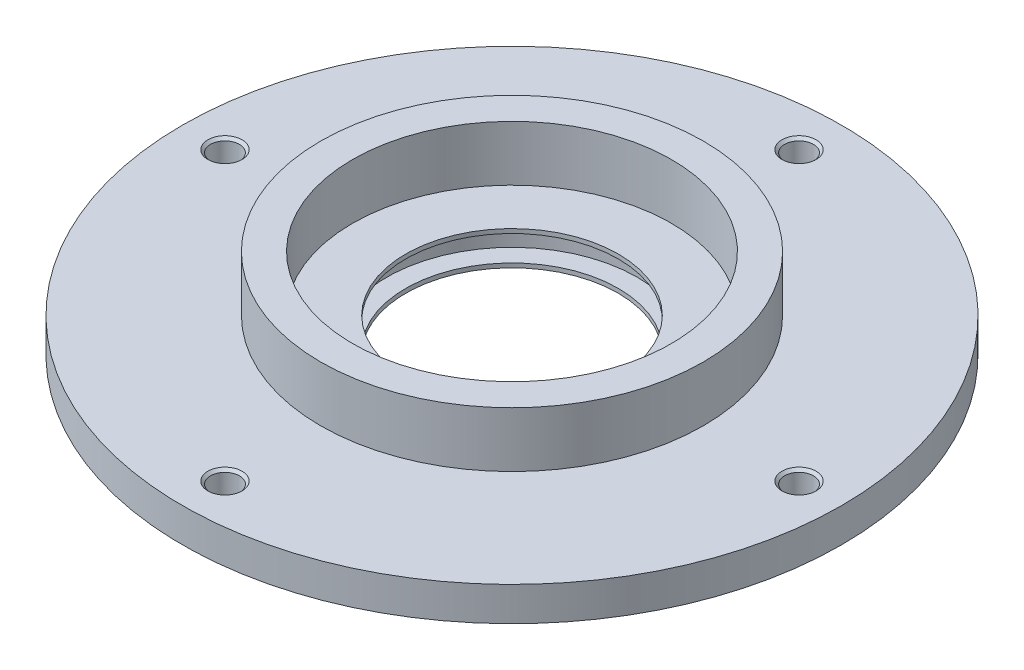
ISO-10303-21;
HEADER;
FILE_DESCRIPTION(('STEP AP214'),'2;1');
FILE_NAME('part.step','',(''),(''),'','','');
FILE_SCHEMA(('AUTOMOTIVE_DESIGN { 1 0 10303 214 1 1 1 1 }'));
ENDSEC;
DATA;
#1=APPLICATION_CONTEXT('core data for automotive mechanical design processes');
#2=APPLICATION_PROTOCOL_DEFINITION('international standard','automotive_design',2000,#1);
#3=PRODUCT_CONTEXT('',#1,'mechanical');
#4=PRODUCT('Part','Part','',(#3));
#5=PRODUCT_RELATED_PRODUCT_CATEGORY('part','',(#4));
#6=PRODUCT_DEFINITION_FORMATION('','',#4);
#7=PRODUCT_DEFINITION_CONTEXT('part definition',#1,'design');
#8=PRODUCT_DEFINITION('design','',#6,#7);
#9=PRODUCT_DEFINITION_SHAPE('','',#8);
#10=(LENGTH_UNIT() NAMED_UNIT(*) SI_UNIT(.MILLI.,.METRE.));
#11=(NAMED_UNIT(*) PLANE_ANGLE_UNIT() SI_UNIT($,.RADIAN.));
#12=(NAMED_UNIT(*) SI_UNIT($,.STERADIAN.) SOLID_ANGLE_UNIT());
#13=UNCERTAINTY_MEASURE_WITH_UNIT(LENGTH_MEASURE(1.E-05),#10,'distance_accuracy_value','');
#14=(GEOMETRIC_REPRESENTATION_CONTEXT(3) GLOBAL_UNCERTAINTY_ASSIGNED_CONTEXT((#13)) GLOBAL_UNIT_ASSIGNED_CONTEXT((#10,
#11,#12)) REPRESENTATION_CONTEXT('',''));
#15=CARTESIAN_POINT('',(0.,0.,0.));
#16=DIRECTION('',(0.,0.,1.));
#17=DIRECTION('',(1.,0.,0.));
#18=AXIS2_PLACEMENT_3D('',#15,#16,#17);
#19=CARTESIAN_POINT('',(0.,21.,0.));
#20=DIRECTION('',(0.,-1.,0.));
#21=DIRECTION('',(0.,0.,-1.));
#22=AXIS2_PLACEMENT_3D('',#19,#20,#21);
#23=CYLINDRICAL_SURFACE('',#22,25.);
#24=CARTESIAN_POINT('',(0.,7.99999999999999,0.));
#25=DIRECTION('',(0.,-1.,0.));
#26=DIRECTION('',(1.,0.,0.));
#27=AXIS2_PLACEMENT_3D('',#24,#25,#26);
#28=CIRCLE('',#27,25.);
#29=CARTESIAN_POINT('',(25.,8.,0.));
#30=VERTEX_POINT('',#29);
#31=EDGE_CURVE('E58',#30,#30,#28,.F.);
#32=ORIENTED_EDGE('',*,*,#31,.T.);
#33=EDGE_LOOP('',(#32));
#34=FACE_BOUND('',#33,.T.);
#35=CARTESIAN_POINT('',(0.,7.,0.));
#36=DIRECTION('',(0.,-1.,0.));
#37=DIRECTION('',(0.,0.,-1.));
#38=AXIS2_PLACEMENT_3D('',#35,#36,#37);
#39=CIRCLE('',#38,25.);
#40=CARTESIAN_POINT('',(0.,7.,-25.));
#41=VERTEX_POINT('',#40);
#42=EDGE_CURVE('E61',#41,#41,#39,.T.);
#43=ORIENTED_EDGE('',*,*,#42,.T.);
#44=EDGE_LOOP('',(#43));
#45=FACE_BOUND('',#44,.T.);
#46=ADVANCED_FACE('F43',(#34,#45),#23,.F.);
#47=CARTESIAN_POINT('',(0.,0.,0.));
#48=DIRECTION('',(0.,1.,0.));
#49=DIRECTION('',(-1.,0.,0.));
#50=AXIS2_PLACEMENT_3D('',#47,#48,#49);
#51=PLANE('',#50);
#52=CARTESIAN_POINT('',(0.,0.,0.));
#53=DIRECTION('',(0.,1.,0.));
#54=DIRECTION('',(0.,0.,1.));
#55=AXIS2_PLACEMENT_3D('',#52,#53,#54);
#56=CIRCLE('',#55,25.);
#57=CARTESIAN_POINT('',(0.,0.,25.));
#58=VERTEX_POINT('',#57);
#59=EDGE_CURVE('E64',#58,#58,#56,.T.);
#60=ORIENTED_EDGE('',*,*,#59,.T.);
#61=EDGE_LOOP('',(#60));
#62=FACE_BOUND('',#61,.T.);
#63=CARTESIAN_POINT('',(-67.5,-1.28369537222284E-13,0.));
#64=DIRECTION('',(0.,1.,0.));
#65=DIRECTION('',(0.,0.,1.));
#66=AXIS2_PLACEMENT_3D('',#63,#64,#65);
#67=CIRCLE('',#66,3.4);
#68=CARTESIAN_POINT('',(-67.5,-1.28369537222284E-13,3.4));
#69=VERTEX_POINT('',#68);
#70=EDGE_CURVE('E83',#69,#69,#67,.T.);
#71=ORIENTED_EDGE('',*,*,#70,.T.);
#72=EDGE_LOOP('',(#71));
#73=FACE_BOUND('',#72,.T.);
#74=CARTESIAN_POINT('',(67.5,0.,0.));
#75=DIRECTION('',(0.,1.,0.));
#76=DIRECTION('',(0.,0.,1.));
#77=AXIS2_PLACEMENT_3D('',#74,#75,#76);
#78=CIRCLE('',#77,3.4);
#79=CARTESIAN_POINT('',(67.5,0.,3.4));
#80=VERTEX_POINT('',#79);
#81=EDGE_CURVE('E94',#80,#80,#78,.T.);
#82=ORIENTED_EDGE('',*,*,#81,.T.);
#83=EDGE_LOOP('',(#82));
#84=FACE_BOUND('',#83,.T.);
#85=CARTESIAN_POINT('',(0.,0.,67.5));
#86=DIRECTION('',(0.,1.,0.));
#87=DIRECTION('',(0.,0.,1.));
#88=AXIS2_PLACEMENT_3D('',#85,#86,#87);
#89=CIRCLE('',#88,3.4);
#90=CARTESIAN_POINT('',(0.,0.,70.9));
#91=VERTEX_POINT('',#90);
#92=EDGE_CURVE('E101',#91,#91,#89,.T.);
#93=ORIENTED_EDGE('',*,*,#92,.T.);
#94=EDGE_LOOP('',(#93));
#95=FACE_BOUND('',#94,.T.);
#96=CARTESIAN_POINT('',(0.,0.,-67.5));
#97=DIRECTION('',(0.,1.,0.));
#98=DIRECTION('',(0.,0.,1.));
#99=AXIS2_PLACEMENT_3D('',#96,#97,#98);
#100=CIRCLE('',#99,3.4);
#101=CARTESIAN_POINT('',(0.,0.,-64.1));
#102=VERTEX_POINT('',#101);
#103=EDGE_CURVE('E115',#102,#102,#100,.T.);
#104=ORIENTED_EDGE('',*,*,#103,.T.);
#105=EDGE_LOOP('',(#104));
#106=FACE_BOUND('',#105,.T.);
#107=CARTESIAN_POINT('',(0.,0.,0.));
#108=DIRECTION('',(0.,1.,0.));
#109=DIRECTION('',(-1.,0.,0.));
#110=AXIS2_PLACEMENT_3D('',#107,#108,#109);
#111=CIRCLE('',#110,77.5);
#112=CARTESIAN_POINT('',(-77.5,0.,0.));
#113=VERTEX_POINT('',#112);
#114=EDGE_CURVE('E10',#113,#113,#111,.T.);
#115=ORIENTED_EDGE('',*,*,#114,.F.);
#116=EDGE_LOOP('',(#115));
#117=FACE_BOUND('',#116,.T.);
#118=ADVANCED_FACE('F44',(#62,#73,#84,#95,#106,#117),#51,.F.);
#119=CARTESIAN_POINT('',(0.,8.,0.));
#120=DIRECTION('',(0.,1.,0.));
#121=DIRECTION('',(-1.,0.,0.));
#122=AXIS2_PLACEMENT_3D('',#119,#120,#121);
#123=CYLINDRICAL_SURFACE('',#122,77.5);
#124=CARTESIAN_POINT('',(0.,7.99999999999997,0.));
#125=DIRECTION('',(0.,1.,0.));
#126=DIRECTION('',(-1.,0.,0.));
#127=AXIS2_PLACEMENT_3D('',#124,#125,#126);
#128=CIRCLE('',#127,77.5);
#129=CARTESIAN_POINT('',(-77.5,7.99999999999993,0.));
#130=VERTEX_POINT('',#129);
#131=EDGE_CURVE('E51',#130,#130,#128,.T.);
#132=ORIENTED_EDGE('',*,*,#131,.F.);
#133=EDGE_LOOP('',(#132));
#134=FACE_BOUND('',#133,.T.);
#135=ORIENTED_EDGE('',*,*,#114,.T.);
#136=EDGE_LOOP('',(#135));
#137=FACE_BOUND('',#136,.T.);
#138=ADVANCED_FACE('F131',(#134,#137),#123,.T.);
#139=CARTESIAN_POINT('',(77.5,8.00000000000001,0.));
#140=DIRECTION('',(0.,-1.,0.));
#141=DIRECTION('',(1.,0.,0.));
#142=AXIS2_PLACEMENT_3D('',#139,#140,#141);
#143=PLANE('',#142);
#144=CARTESIAN_POINT('',(-67.5,7.99999999999994,0.));
#145=DIRECTION('',(0.,1.,0.));
#146=DIRECTION('',(0.,0.,1.));
#147=AXIS2_PLACEMENT_3D('',#144,#145,#146);
#148=CIRCLE('',#147,4.025);
#149=CARTESIAN_POINT('',(-67.5,7.99999999999994,4.025));
#150=VERTEX_POINT('',#149);
#151=EDGE_CURVE('E65',#150,#150,#148,.T.);
#152=ORIENTED_EDGE('',*,*,#151,.F.);
#153=EDGE_LOOP('',(#152));
#154=FACE_BOUND('',#153,.T.);
#155=CARTESIAN_POINT('',(67.5,8.,0.));
#156=DIRECTION('',(0.,1.,0.));
#157=DIRECTION('',(0.,0.,1.));
#158=AXIS2_PLACEMENT_3D('',#155,#156,#157);
#159=CIRCLE('',#158,4.025);
#160=CARTESIAN_POINT('',(67.5,8.,4.025));
#161=VERTEX_POINT('',#160);
#162=EDGE_CURVE('E87',#161,#161,#159,.T.);
#163=ORIENTED_EDGE('',*,*,#162,.F.);
#164=EDGE_LOOP('',(#163));
#165=FACE_BOUND('',#164,.T.);
#166=CARTESIAN_POINT('',(0.,7.99999999999997,67.5));
#167=DIRECTION('',(0.,1.,0.));
#168=DIRECTION('',(0.,0.,1.));
#169=AXIS2_PLACEMENT_3D('',#166,#167,#168);
#170=CIRCLE('',#169,4.025);
#171=CARTESIAN_POINT('',(0.,7.99999999999997,71.525));
#172=VERTEX_POINT('',#171);
#173=EDGE_CURVE('E97',#172,#172,#170,.T.);
#174=ORIENTED_EDGE('',*,*,#173,.F.);
#175=EDGE_LOOP('',(#174));
#176=FACE_BOUND('',#175,.T.);
#177=CARTESIAN_POINT('',(0.,7.99999999999997,-67.5));
#178=DIRECTION('',(0.,1.,0.));
#179=DIRECTION('',(0.,0.,1.));
#180=AXIS2_PLACEMENT_3D('',#177,#178,#179);
#181=CIRCLE('',#180,4.025);
#182=CARTESIAN_POINT('',(0.,7.99999999999997,-63.475));
#183=VERTEX_POINT('',#182);
#184=EDGE_CURVE('E106',#183,#183,#181,.T.);
#185=ORIENTED_EDGE('',*,*,#184,.F.);
#186=EDGE_LOOP('',(#185));
#187=FACE_BOUND('',#186,.T.);
#188=CARTESIAN_POINT('',(0.,7.99999999999998,0.));
#189=DIRECTION('',(0.,1.,0.));
#190=DIRECTION('',(-1.,0.,0.));
#191=AXIS2_PLACEMENT_3D('',#188,#189,#190);
#192=CIRCLE('',#191,45.);
#193=CARTESIAN_POINT('',(-45.,7.99999999999996,0.));
#194=VERTEX_POINT('',#193);
#195=EDGE_CURVE('E57',#194,#194,#192,.T.);
#196=ORIENTED_EDGE('',*,*,#195,.F.);
#197=EDGE_LOOP('',(#196));
#198=FACE_BOUND('',#197,.T.);
#199=ORIENTED_EDGE('',*,*,#131,.T.);
#200=EDGE_LOOP('',(#199));
#201=FACE_BOUND('',#200,.T.);
#202=ADVANCED_FACE('F129',(#154,#165,#176,#187,#198,#201),#143,.F.);
#203=CARTESIAN_POINT('',(0.,8.,0.));
#204=DIRECTION('',(0.,1.,0.));
#205=DIRECTION('',(-1.,0.,0.));
#206=AXIS2_PLACEMENT_3D('',#203,#204,#205);
#207=CYLINDRICAL_SURFACE('',#206,45.);
#208=CARTESIAN_POINT('',(0.,21.,0.));
#209=DIRECTION('',(0.,1.,0.));
#210=DIRECTION('',(-1.,0.,0.));
#211=AXIS2_PLACEMENT_3D('',#208,#209,#210);
#212=CIRCLE('',#211,45.);
#213=CARTESIAN_POINT('',(-45.,21.,0.));
#214=VERTEX_POINT('',#213);
#215=EDGE_CURVE('E122',#214,#214,#212,.T.);
#216=ORIENTED_EDGE('',*,*,#215,.F.);
#217=EDGE_LOOP('',(#216));
#218=FACE_BOUND('',#217,.T.);
#219=ORIENTED_EDGE('',*,*,#195,.T.);
#220=EDGE_LOOP('',(#219));
#221=FACE_BOUND('',#220,.T.);
#222=ADVANCED_FACE('F127',(#218,#221),#207,.T.);
#223=CARTESIAN_POINT('',(45.,21.,0.));
#224=DIRECTION('',(0.,-1.,0.));
#225=DIRECTION('',(1.,0.,0.));
#226=AXIS2_PLACEMENT_3D('',#223,#224,#225);
#227=PLANE('',#226);
#228=CARTESIAN_POINT('',(0.,21.,0.));
#229=DIRECTION('',(0.,1.,0.));
#230=DIRECTION('',(-1.,0.,0.));
#231=AXIS2_PLACEMENT_3D('',#228,#229,#230);
#232=CIRCLE('',#231,37.5);
#233=CARTESIAN_POINT('',(-37.5,21.,0.));
#234=VERTEX_POINT('',#233);
#235=EDGE_CURVE('E117',#234,#234,#232,.T.);
#236=ORIENTED_EDGE('',*,*,#235,.F.);
#237=EDGE_LOOP('',(#236));
#238=FACE_BOUND('',#237,.T.);
#239=ORIENTED_EDGE('',*,*,#215,.T.);
#240=EDGE_LOOP('',(#239));
#241=FACE_BOUND('',#240,.T.);
#242=ADVANCED_FACE('F202',(#238,#241),#227,.F.);
#243=CARTESIAN_POINT('',(0.,8.,0.));
#244=DIRECTION('',(0.,1.,0.));
#245=DIRECTION('',(-1.,0.,0.));
#246=AXIS2_PLACEMENT_3D('',#243,#244,#245);
#247=CYLINDRICAL_SURFACE('',#246,37.5);
#248=CARTESIAN_POINT('',(0.,7.99999999999999,0.));
#249=DIRECTION('',(0.,1.,0.));
#250=DIRECTION('',(-1.,0.,0.));
#251=AXIS2_PLACEMENT_3D('',#248,#249,#250);
#252=CIRCLE('',#251,37.5);
#253=CARTESIAN_POINT('',(-37.5,7.99999999999997,0.));
#254=VERTEX_POINT('',#253);
#255=EDGE_CURVE('E114',#254,#254,#252,.T.);
#256=ORIENTED_EDGE('',*,*,#255,.F.);
#257=EDGE_LOOP('',(#256));
#258=FACE_BOUND('',#257,.T.);
#259=ORIENTED_EDGE('',*,*,#235,.T.);
#260=EDGE_LOOP('',(#259));
#261=FACE_BOUND('',#260,.T.);
#262=ADVANCED_FACE('F203',(#258,#261),#247,.F.);
#263=CARTESIAN_POINT('',(37.5,8.00000000000001,0.));
#264=DIRECTION('',(0.,-1.,0.));
#265=DIRECTION('',(1.,0.,0.));
#266=AXIS2_PLACEMENT_3D('',#263,#264,#265);
#267=PLANE('',#266);
#268=ORIENTED_EDGE('',*,*,#31,.F.);
#269=EDGE_LOOP('',(#268));
#270=FACE_BOUND('',#269,.T.);
#271=ORIENTED_EDGE('',*,*,#255,.T.);
#272=EDGE_LOOP('',(#271));
#273=FACE_BOUND('',#272,.T.);
#274=ADVANCED_FACE('F179',(#270,#273),#267,.F.);
#275=CARTESIAN_POINT('',(0.,7.99999999999997,-67.5));
#276=DIRECTION('',(0.,1.,0.));
#277=DIRECTION('',(0.,0.,1.));
#278=AXIS2_PLACEMENT_3D('',#275,#276,#277);
#279=CYLINDRICAL_SURFACE('',#278,3.4);
#280=ORIENTED_EDGE('',*,*,#103,.F.);
#281=EDGE_LOOP('',(#280));
#282=FACE_BOUND('',#281,.T.);
#283=CARTESIAN_POINT('',(0.,7.37499999999997,-67.5));
#284=DIRECTION('',(0.,1.,0.));
#285=DIRECTION('',(0.,0.,1.));
#286=AXIS2_PLACEMENT_3D('',#283,#284,#285);
#287=CIRCLE('',#286,3.4);
#288=CARTESIAN_POINT('',(0.,7.37499999999997,-64.1));
#289=VERTEX_POINT('',#288);
#290=EDGE_CURVE('E107',#289,#289,#287,.T.);
#291=ORIENTED_EDGE('',*,*,#290,.T.);
#292=EDGE_LOOP('',(#291));
#293=FACE_BOUND('',#292,.T.);
#294=ADVANCED_FACE('F176',(#282,#293),#279,.F.);
#295=CARTESIAN_POINT('',(0.,7.99999999999997,-67.5));
#296=DIRECTION('',(0.,1.,0.));
#297=DIRECTION('',(0.,0.,1.));
#298=AXIS2_PLACEMENT_3D('',#295,#296,#297);
#299=CONICAL_SURFACE('',#298,4.025,0.785398163397447);
#300=ORIENTED_EDGE('',*,*,#290,.F.);
#301=EDGE_LOOP('',(#300));
#302=FACE_BOUND('',#301,.T.);
#303=ORIENTED_EDGE('',*,*,#184,.T.);
#304=EDGE_LOOP('',(#303));
#305=FACE_BOUND('',#304,.T.);
#306=ADVANCED_FACE('F177',(#302,#305),#299,.F.);
#307=CARTESIAN_POINT('',(0.,7.99999999999997,67.5));
#308=DIRECTION('',(0.,1.,0.));
#309=DIRECTION('',(0.,0.,1.));
#310=AXIS2_PLACEMENT_3D('',#307,#308,#309);
#311=CYLINDRICAL_SURFACE('',#310,3.4);
#312=ORIENTED_EDGE('',*,*,#92,.F.);
#313=EDGE_LOOP('',(#312));
#314=FACE_BOUND('',#313,.T.);
#315=CARTESIAN_POINT('',(0.,7.37499999999997,67.5));
#316=DIRECTION('',(0.,1.,0.));
#317=DIRECTION('',(0.,0.,1.));
#318=AXIS2_PLACEMENT_3D('',#315,#316,#317);
#319=CIRCLE('',#318,3.4);
#320=CARTESIAN_POINT('',(0.,7.37499999999997,70.9));
#321=VERTEX_POINT('',#320);
#322=EDGE_CURVE('E99',#321,#321,#319,.T.);
#323=ORIENTED_EDGE('',*,*,#322,.T.);
#324=EDGE_LOOP('',(#323));
#325=FACE_BOUND('',#324,.T.);
#326=ADVANCED_FACE('F187',(#314,#325),#311,.F.);
#327=CARTESIAN_POINT('',(0.,7.99999999999997,67.5));
#328=DIRECTION('',(0.,1.,0.));
#329=DIRECTION('',(0.,0.,1.));
#330=AXIS2_PLACEMENT_3D('',#327,#328,#329);
#331=CONICAL_SURFACE('',#330,4.025,0.785398163397447);
#332=ORIENTED_EDGE('',*,*,#322,.F.);
#333=EDGE_LOOP('',(#332));
#334=FACE_BOUND('',#333,.T.);
#335=ORIENTED_EDGE('',*,*,#173,.T.);
#336=EDGE_LOOP('',(#335));
#337=FACE_BOUND('',#336,.T.);
#338=ADVANCED_FACE('F193',(#334,#337),#331,.F.);
#339=CARTESIAN_POINT('',(67.5,8.,0.));
#340=DIRECTION('',(0.,1.,0.));
#341=DIRECTION('',(0.,0.,1.));
#342=AXIS2_PLACEMENT_3D('',#339,#340,#341);
#343=CYLINDRICAL_SURFACE('',#342,3.4);
#344=ORIENTED_EDGE('',*,*,#81,.F.);
#345=EDGE_LOOP('',(#344));
#346=FACE_BOUND('',#345,.T.);
#347=CARTESIAN_POINT('',(67.5,7.375,0.));
#348=DIRECTION('',(0.,1.,0.));
#349=DIRECTION('',(0.,0.,1.));
#350=AXIS2_PLACEMENT_3D('',#347,#348,#349);
#351=CIRCLE('',#350,3.4);
#352=CARTESIAN_POINT('',(67.5,7.375,3.4));
#353=VERTEX_POINT('',#352);
#354=EDGE_CURVE('E93',#353,#353,#351,.T.);
#355=ORIENTED_EDGE('',*,*,#354,.T.);
#356=EDGE_LOOP('',(#355));
#357=FACE_BOUND('',#356,.T.);
#358=ADVANCED_FACE('F244',(#346,#357),#343,.F.);
#359=CARTESIAN_POINT('',(67.5,8.,0.));
#360=DIRECTION('',(0.,1.,0.));
#361=DIRECTION('',(0.,0.,1.));
#362=AXIS2_PLACEMENT_3D('',#359,#360,#361);
#363=CONICAL_SURFACE('',#362,4.025,0.785398163397446);
#364=ORIENTED_EDGE('',*,*,#354,.F.);
#365=EDGE_LOOP('',(#364));
#366=FACE_BOUND('',#365,.T.);
#367=ORIENTED_EDGE('',*,*,#162,.T.);
#368=EDGE_LOOP('',(#367));
#369=FACE_BOUND('',#368,.T.);
#370=ADVANCED_FACE('F248',(#366,#369),#363,.F.);
#371=CARTESIAN_POINT('',(-67.5,7.99999999999994,0.));
#372=DIRECTION('',(0.,1.,0.));
#373=DIRECTION('',(0.,0.,1.));
#374=AXIS2_PLACEMENT_3D('',#371,#372,#373);
#375=CYLINDRICAL_SURFACE('',#374,3.4);
#376=ORIENTED_EDGE('',*,*,#70,.F.);
#377=EDGE_LOOP('',(#376));
#378=FACE_BOUND('',#377,.T.);
#379=CARTESIAN_POINT('',(-67.5,7.37499999999994,0.));
#380=DIRECTION('',(0.,1.,0.));
#381=DIRECTION('',(0.,0.,1.));
#382=AXIS2_PLACEMENT_3D('',#379,#380,#381);
#383=CIRCLE('',#382,3.4);
#384=CARTESIAN_POINT('',(-67.5,7.37499999999994,3.4));
#385=VERTEX_POINT('',#384);
#386=EDGE_CURVE('E85',#385,#385,#383,.T.);
#387=ORIENTED_EDGE('',*,*,#386,.T.);
#388=EDGE_LOOP('',(#387));
#389=FACE_BOUND('',#388,.T.);
#390=ADVANCED_FACE('F163',(#378,#389),#375,.F.);
#391=CARTESIAN_POINT('',(-67.5,7.99999999999994,0.));
#392=DIRECTION('',(0.,1.,0.));
#393=DIRECTION('',(0.,0.,1.));
#394=AXIS2_PLACEMENT_3D('',#391,#392,#393);
#395=CONICAL_SURFACE('',#394,4.025,0.785398163397446);
#396=ORIENTED_EDGE('',*,*,#386,.F.);
#397=EDGE_LOOP('',(#396));
#398=FACE_BOUND('',#397,.T.);
#399=ORIENTED_EDGE('',*,*,#151,.T.);
#400=EDGE_LOOP('',(#399));
#401=FACE_BOUND('',#400,.T.);
#402=ADVANCED_FACE('F152',(#398,#401),#395,.F.);
#403=CARTESIAN_POINT('',(0.,1.,0.));
#404=DIRECTION('',(0.,-1.,0.));
#405=DIRECTION('',(0.,0.,-1.));
#406=AXIS2_PLACEMENT_3D('',#403,#404,#405);
#407=CIRCLE('',#406,25.);
#408=CARTESIAN_POINT('',(0.,1.,-25.));
#409=VERTEX_POINT('',#408);
#410=EDGE_CURVE('E50',#409,#409,#407,.T.);
#411=ORIENTED_EDGE('',*,*,#410,.F.);
#412=EDGE_LOOP('',(#411));
#413=FACE_BOUND('',#412,.T.);
#414=ORIENTED_EDGE('',*,*,#59,.F.);
#415=EDGE_LOOP('',(#414));
#416=FACE_BOUND('',#415,.T.);
#417=ADVANCED_FACE('F143',(#413,#416),#23,.F.);
#418=CARTESIAN_POINT('',(0.,1.,0.));
#419=DIRECTION('',(0.,-1.,0.));
#420=DIRECTION('',(0.,0.,-1.));
#421=AXIS2_PLACEMENT_3D('',#418,#419,#420);
#422=PLANE('',#421);
#423=ORIENTED_EDGE('',*,*,#410,.T.);
#424=EDGE_LOOP('',(#423));
#425=FACE_BOUND('',#424,.T.);
#426=CARTESIAN_POINT('',(0.,1.,0.));
#427=DIRECTION('',(0.,-1.,0.));
#428=DIRECTION('',(0.,0.,-1.));
#429=AXIS2_PLACEMENT_3D('',#426,#427,#428);
#430=CIRCLE('',#429,29.5);
#431=CARTESIAN_POINT('',(0.,1.,-29.5));
#432=VERTEX_POINT('',#431);
#433=EDGE_CURVE('E66',#432,#432,#430,.T.);
#434=ORIENTED_EDGE('',*,*,#433,.F.);
#435=EDGE_LOOP('',(#434));
#436=FACE_BOUND('',#435,.T.);
#437=ADVANCED_FACE('F155',(#425,#436),#422,.F.);
#438=CARTESIAN_POINT('',(0.,0.,0.));
#439=DIRECTION('',(0.,-1.,0.));
#440=DIRECTION('',(0.,0.,-1.));
#441=AXIS2_PLACEMENT_3D('',#438,#439,#440);
#442=CYLINDRICAL_SURFACE('',#441,29.5);
#443=ORIENTED_EDGE('',*,*,#433,.T.);
#444=EDGE_LOOP('',(#443));
#445=FACE_BOUND('',#444,.T.);
#446=CARTESIAN_POINT('',(0.,7.,0.));
#447=DIRECTION('',(0.,-1.,0.));
#448=DIRECTION('',(0.,0.,-1.));
#449=AXIS2_PLACEMENT_3D('',#446,#447,#448);
#450=CIRCLE('',#449,29.5);
#451=CARTESIAN_POINT('',(0.,7.,-29.5));
#452=VERTEX_POINT('',#451);
#453=EDGE_CURVE('E73',#452,#452,#450,.T.);
#454=ORIENTED_EDGE('',*,*,#453,.F.);
#455=EDGE_LOOP('',(#454));
#456=FACE_BOUND('',#455,.T.);
#457=ADVANCED_FACE('F156',(#445,#456),#442,.F.);
#458=CARTESIAN_POINT('',(0.,7.,0.));
#459=DIRECTION('',(0.,-1.,0.));
#460=DIRECTION('',(0.,0.,-1.));
#461=AXIS2_PLACEMENT_3D('',#458,#459,#460);
#462=PLANE('',#461);
#463=ORIENTED_EDGE('',*,*,#42,.F.);
#464=EDGE_LOOP('',(#463));
#465=FACE_BOUND('',#464,.T.);
#466=ORIENTED_EDGE('',*,*,#453,.T.);
#467=EDGE_LOOP('',(#466));
#468=FACE_BOUND('',#467,.T.);
#469=ADVANCED_FACE('F347',(#465,#468),#462,.T.);
#470=CLOSED_SHELL('',(#46,#118,#138,#202,#222,#242,#262,#274,#294,#306,#326,#338,#358,#370,#390,
#402,#417,#437,#457,#469));
#471=MANIFOLD_SOLID_BREP('B2',#470);
#472=ADVANCED_BREP_SHAPE_REPRESENTATION('',(#18,#471),#14);
#473=SHAPE_DEFINITION_REPRESENTATION(#9,#472);
ENDSEC;
END-ISO-10303-21;
